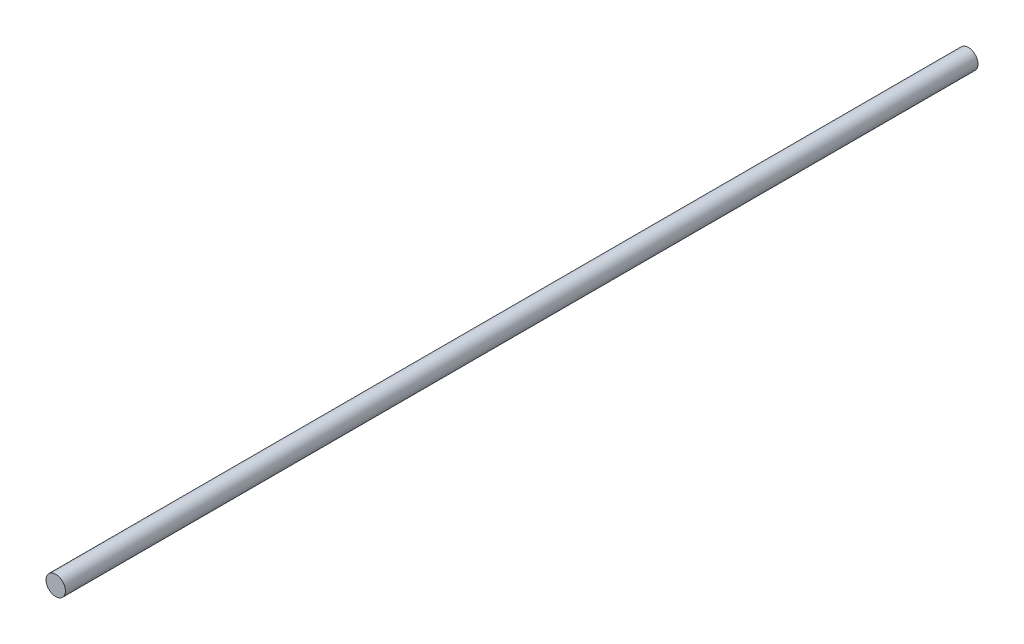
ISO-10303-21;
HEADER;
FILE_DESCRIPTION(('STEP AP214'),'2;1');
FILE_NAME('part.step','',(''),(''),'','','');
FILE_SCHEMA(('AUTOMOTIVE_DESIGN { 1 0 10303 214 1 1 1 1 }'));
ENDSEC;
DATA;
#1=APPLICATION_CONTEXT('core data for automotive mechanical design processes');
#2=APPLICATION_PROTOCOL_DEFINITION('international standard','automotive_design',2000,#1);
#3=PRODUCT_CONTEXT('',#1,'mechanical');
#4=PRODUCT('Part','Part','',(#3));
#5=PRODUCT_RELATED_PRODUCT_CATEGORY('part','',(#4));
#6=PRODUCT_DEFINITION_FORMATION('','',#4);
#7=PRODUCT_DEFINITION_CONTEXT('part definition',#1,'design');
#8=PRODUCT_DEFINITION('design','',#6,#7);
#9=PRODUCT_DEFINITION_SHAPE('','',#8);
#10=(LENGTH_UNIT() NAMED_UNIT(*) SI_UNIT(.MILLI.,.METRE.));
#11=(NAMED_UNIT(*) PLANE_ANGLE_UNIT() SI_UNIT($,.RADIAN.));
#12=(NAMED_UNIT(*) SI_UNIT($,.STERADIAN.) SOLID_ANGLE_UNIT());
#13=UNCERTAINTY_MEASURE_WITH_UNIT(LENGTH_MEASURE(1.E-05),#10,'distance_accuracy_value','');
#14=(GEOMETRIC_REPRESENTATION_CONTEXT(3) GLOBAL_UNCERTAINTY_ASSIGNED_CONTEXT((#13)) GLOBAL_UNIT_ASSIGNED_CONTEXT((#10,
#11,#12)) REPRESENTATION_CONTEXT('',''));
#15=CARTESIAN_POINT('',(0.,0.,0.));
#16=DIRECTION('',(0.,0.,1.));
#17=DIRECTION('',(1.,0.,0.));
#18=AXIS2_PLACEMENT_3D('',#15,#16,#17);
#19=CARTESIAN_POINT('',(0.,0.,596.9));
#20=DIRECTION('',(0.,0.,-1.));
#21=DIRECTION('',(-1.,0.,0.));
#22=AXIS2_PLACEMENT_3D('',#19,#20,#21);
#23=CYLINDRICAL_SURFACE('',#22,6.35);
#24=CARTESIAN_POINT('',(0.,0.,596.9));
#25=DIRECTION('',(0.,0.,1.));
#26=DIRECTION('',(1.,0.,0.));
#27=AXIS2_PLACEMENT_3D('',#24,#25,#26);
#28=CIRCLE('',#27,6.35);
#29=CARTESIAN_POINT('',(6.35,0.,596.9));
#30=VERTEX_POINT('',#29);
#31=EDGE_CURVE('E10',#30,#30,#28,.T.);
#32=ORIENTED_EDGE('',*,*,#31,.F.);
#33=EDGE_LOOP('',(#32));
#34=FACE_BOUND('',#33,.T.);
#35=CARTESIAN_POINT('',(0.,0.,0.));
#36=DIRECTION('',(0.,0.,1.));
#37=DIRECTION('',(1.,0.,0.));
#38=AXIS2_PLACEMENT_3D('',#35,#36,#37);
#39=CIRCLE('',#38,6.35);
#40=CARTESIAN_POINT('',(6.35,0.,0.));
#41=VERTEX_POINT('',#40);
#42=EDGE_CURVE('E34',#41,#41,#39,.T.);
#43=ORIENTED_EDGE('',*,*,#42,.T.);
#44=EDGE_LOOP('',(#43));
#45=FACE_BOUND('',#44,.T.);
#46=ADVANCED_FACE('F31',(#34,#45),#23,.T.);
#47=CARTESIAN_POINT('',(0.,0.,596.9));
#48=DIRECTION('',(0.,0.,1.));
#49=DIRECTION('',(1.,0.,0.));
#50=AXIS2_PLACEMENT_3D('',#47,#48,#49);
#51=PLANE('',#50);
#52=ORIENTED_EDGE('',*,*,#31,.T.);
#53=EDGE_LOOP('',(#52));
#54=FACE_BOUND('',#53,.T.);
#55=ADVANCED_FACE('F46',(#54),#51,.T.);
#56=CARTESIAN_POINT('',(0.,0.,0.));
#57=DIRECTION('',(0.,0.,1.));
#58=DIRECTION('',(1.,0.,0.));
#59=AXIS2_PLACEMENT_3D('',#56,#57,#58);
#60=PLANE('',#59);
#61=ORIENTED_EDGE('',*,*,#42,.F.);
#62=EDGE_LOOP('',(#61));
#63=FACE_BOUND('',#62,.T.);
#64=ADVANCED_FACE('F44',(#63),#60,.F.);
#65=CLOSED_SHELL('',(#46,#55,#64));
#66=MANIFOLD_SOLID_BREP('B2',#65);
#67=ADVANCED_BREP_SHAPE_REPRESENTATION('',(#18,#66),#14);
#68=SHAPE_DEFINITION_REPRESENTATION(#9,#67);
ENDSEC;
END-ISO-10303-21;
